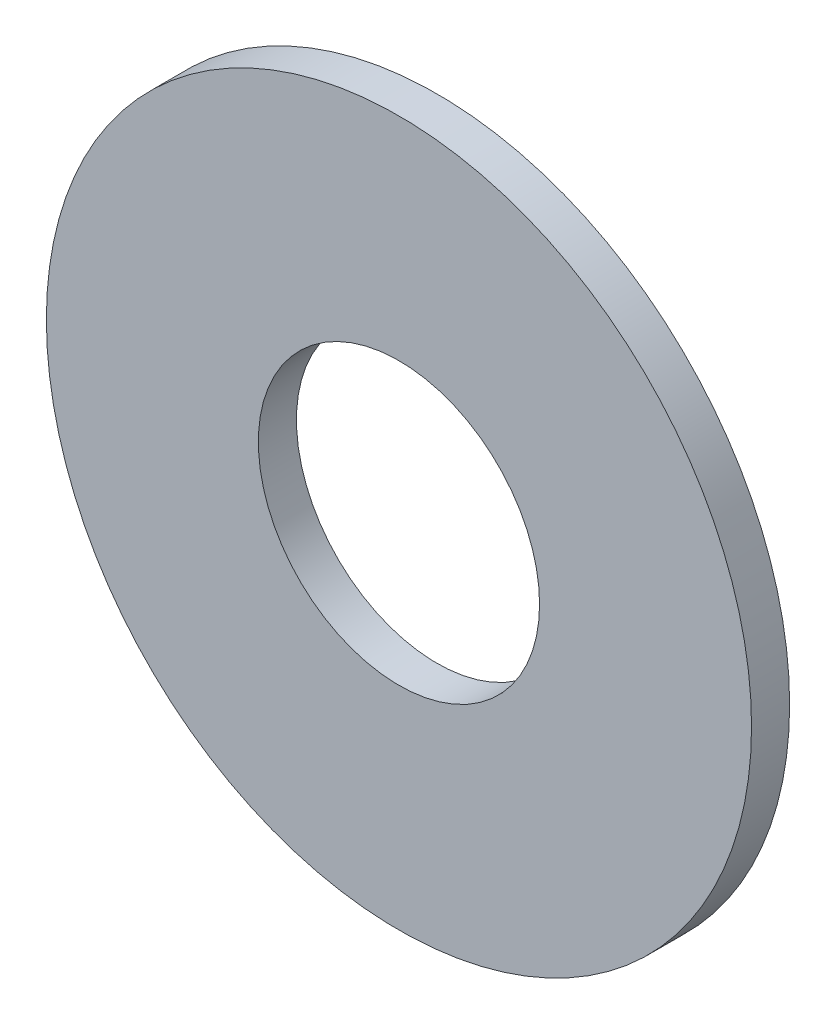
ISO-10303-21;
HEADER;
FILE_DESCRIPTION(('STEP AP214'),'2;1');
FILE_NAME('part.step','',(''),(''),'','','');
FILE_SCHEMA(('AUTOMOTIVE_DESIGN { 1 0 10303 214 1 1 1 1 }'));
ENDSEC;
DATA;
#1=APPLICATION_CONTEXT('core data for automotive mechanical design processes');
#2=APPLICATION_PROTOCOL_DEFINITION('international standard','automotive_design',2000,#1);
#3=PRODUCT_CONTEXT('',#1,'mechanical');
#4=PRODUCT('Part','Part','',(#3));
#5=PRODUCT_RELATED_PRODUCT_CATEGORY('part','',(#4));
#6=PRODUCT_DEFINITION_FORMATION('','',#4);
#7=PRODUCT_DEFINITION_CONTEXT('part definition',#1,'design');
#8=PRODUCT_DEFINITION('design','',#6,#7);
#9=PRODUCT_DEFINITION_SHAPE('','',#8);
#10=(LENGTH_UNIT() NAMED_UNIT(*) SI_UNIT(.MILLI.,.METRE.));
#11=(NAMED_UNIT(*) PLANE_ANGLE_UNIT() SI_UNIT($,.RADIAN.));
#12=(NAMED_UNIT(*) SI_UNIT($,.STERADIAN.) SOLID_ANGLE_UNIT());
#13=UNCERTAINTY_MEASURE_WITH_UNIT(LENGTH_MEASURE(1.E-05),#10,'distance_accuracy_value','');
#14=(GEOMETRIC_REPRESENTATION_CONTEXT(3) GLOBAL_UNCERTAINTY_ASSIGNED_CONTEXT((#13)) GLOBAL_UNIT_ASSIGNED_CONTEXT((#10,
#11,#12)) REPRESENTATION_CONTEXT('',''));
#15=CARTESIAN_POINT('',(0.,0.,0.));
#16=DIRECTION('',(0.,0.,1.));
#17=DIRECTION('',(1.,0.,0.));
#18=AXIS2_PLACEMENT_3D('',#15,#16,#17);
#19=CARTESIAN_POINT('',(0.,0.,6.35));
#20=DIRECTION('',(0.,0.,1.));
#21=DIRECTION('',(1.,0.,0.));
#22=AXIS2_PLACEMENT_3D('',#19,#20,#21);
#23=PLANE('',#22);
#24=CARTESIAN_POINT('',(0.,0.,6.35));
#25=DIRECTION('',(0.,0.,1.));
#26=DIRECTION('',(1.,0.,0.));
#27=AXIS2_PLACEMENT_3D('',#24,#25,#26);
#28=CIRCLE('',#27,58.7797369259773);
#29=CARTESIAN_POINT('',(58.7797369259773,0.,6.35));
#30=VERTEX_POINT('',#29);
#31=EDGE_CURVE('E10',#30,#30,#28,.T.);
#32=ORIENTED_EDGE('',*,*,#31,.T.);
#33=EDGE_LOOP('',(#32));
#34=FACE_BOUND('',#33,.T.);
#35=CARTESIAN_POINT('',(0.,0.,6.35));
#36=DIRECTION('',(0.,0.,1.));
#37=DIRECTION('',(1.,0.,0.));
#38=AXIS2_PLACEMENT_3D('',#35,#36,#37);
#39=CIRCLE('',#38,23.4411625915795);
#40=CARTESIAN_POINT('',(23.4411625915795,0.,6.35));
#41=VERTEX_POINT('',#40);
#42=EDGE_CURVE('E40',#41,#41,#39,.T.);
#43=ORIENTED_EDGE('',*,*,#42,.F.);
#44=EDGE_LOOP('',(#43));
#45=FACE_BOUND('',#44,.T.);
#46=ADVANCED_FACE('F29',(#34,#45),#23,.T.);
#47=CARTESIAN_POINT('',(0.,0.,0.));
#48=DIRECTION('',(0.,0.,1.));
#49=DIRECTION('',(1.,0.,0.));
#50=AXIS2_PLACEMENT_3D('',#47,#48,#49);
#51=PLANE('',#50);
#52=CARTESIAN_POINT('',(0.,0.,0.));
#53=DIRECTION('',(0.,0.,1.));
#54=DIRECTION('',(1.,0.,0.));
#55=AXIS2_PLACEMENT_3D('',#52,#53,#54);
#56=CIRCLE('',#55,58.7797369259773);
#57=CARTESIAN_POINT('',(58.7797369259773,0.,0.));
#58=VERTEX_POINT('',#57);
#59=EDGE_CURVE('E33',#58,#58,#56,.T.);
#60=ORIENTED_EDGE('',*,*,#59,.F.);
#61=EDGE_LOOP('',(#60));
#62=FACE_BOUND('',#61,.T.);
#63=CARTESIAN_POINT('',(0.,0.,0.));
#64=DIRECTION('',(0.,0.,1.));
#65=DIRECTION('',(1.,0.,0.));
#66=AXIS2_PLACEMENT_3D('',#63,#64,#65);
#67=CIRCLE('',#66,23.4411625915795);
#68=CARTESIAN_POINT('',(23.4411625915795,0.,0.));
#69=VERTEX_POINT('',#68);
#70=EDGE_CURVE('E42',#69,#69,#67,.T.);
#71=ORIENTED_EDGE('',*,*,#70,.T.);
#72=EDGE_LOOP('',(#71));
#73=FACE_BOUND('',#72,.T.);
#74=ADVANCED_FACE('F52',(#62,#73),#51,.F.);
#75=CARTESIAN_POINT('',(0.,0.,6.35));
#76=DIRECTION('',(0.,0.,-1.));
#77=DIRECTION('',(-1.,0.,0.));
#78=AXIS2_PLACEMENT_3D('',#75,#76,#77);
#79=CYLINDRICAL_SURFACE('',#78,58.7797369259773);
#80=ORIENTED_EDGE('',*,*,#31,.F.);
#81=EDGE_LOOP('',(#80));
#82=FACE_BOUND('',#81,.T.);
#83=ORIENTED_EDGE('',*,*,#59,.T.);
#84=EDGE_LOOP('',(#83));
#85=FACE_BOUND('',#84,.T.);
#86=ADVANCED_FACE('F31',(#82,#85),#79,.T.);
#87=CARTESIAN_POINT('',(0.,0.,6.35));
#88=DIRECTION('',(0.,0.,-1.));
#89=DIRECTION('',(-1.,0.,0.));
#90=AXIS2_PLACEMENT_3D('',#87,#88,#89);
#91=CYLINDRICAL_SURFACE('',#90,23.4411625915795);
#92=ORIENTED_EDGE('',*,*,#42,.T.);
#93=EDGE_LOOP('',(#92));
#94=FACE_BOUND('',#93,.T.);
#95=ORIENTED_EDGE('',*,*,#70,.F.);
#96=EDGE_LOOP('',(#95));
#97=FACE_BOUND('',#96,.T.);
#98=ADVANCED_FACE('F48',(#94,#97),#91,.F.);
#99=CLOSED_SHELL('',(#46,#74,#86,#98));
#100=MANIFOLD_SOLID_BREP('B2',#99);
#101=ADVANCED_BREP_SHAPE_REPRESENTATION('',(#18,#100),#14);
#102=SHAPE_DEFINITION_REPRESENTATION(#9,#101);
ENDSEC;
END-ISO-10303-21;
